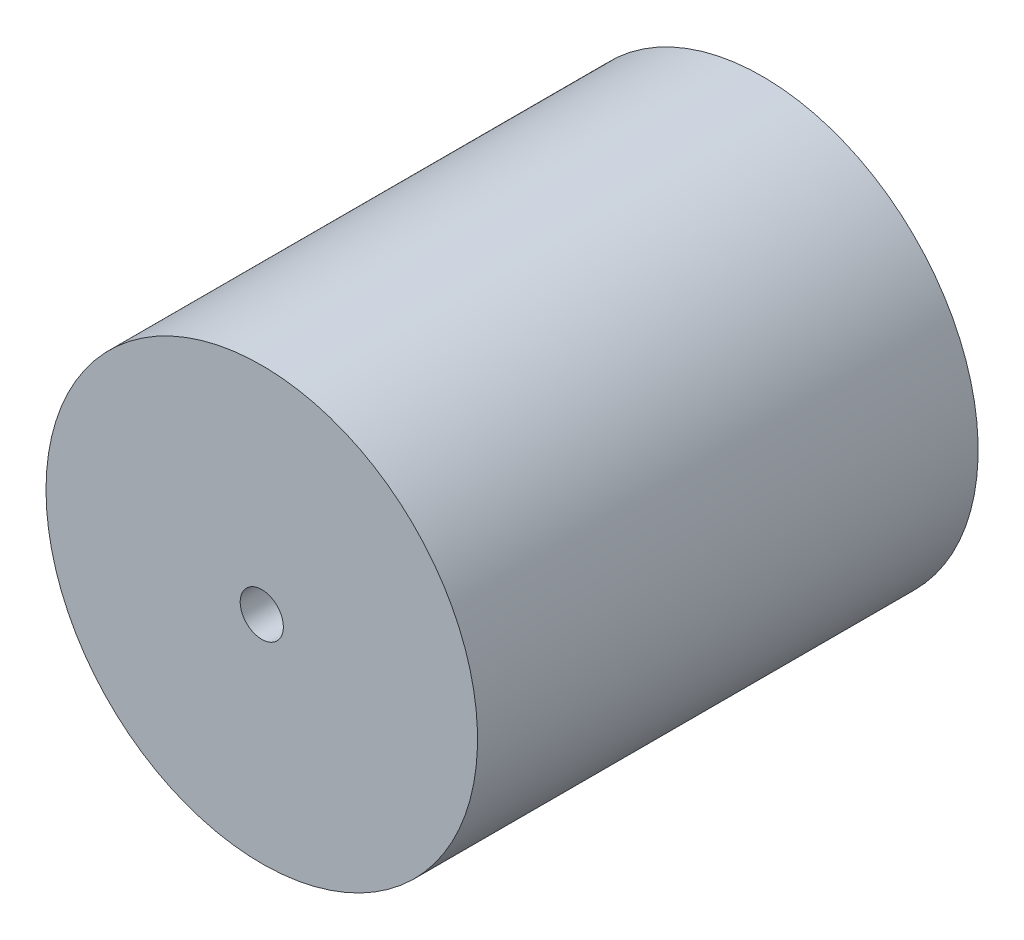
ISO-10303-21;
HEADER;
FILE_DESCRIPTION(('STEP AP214'),'2;1');
FILE_NAME('part.step','',(''),(''),'','','');
FILE_SCHEMA(('AUTOMOTIVE_DESIGN { 1 0 10303 214 1 1 1 1 }'));
ENDSEC;
DATA;
#1=APPLICATION_CONTEXT('core data for automotive mechanical design processes');
#2=APPLICATION_PROTOCOL_DEFINITION('international standard','automotive_design',2000,#1);
#3=PRODUCT_CONTEXT('',#1,'mechanical');
#4=PRODUCT('Part','Part','',(#3));
#5=PRODUCT_RELATED_PRODUCT_CATEGORY('part','',(#4));
#6=PRODUCT_DEFINITION_FORMATION('','',#4);
#7=PRODUCT_DEFINITION_CONTEXT('part definition',#1,'design');
#8=PRODUCT_DEFINITION('design','',#6,#7);
#9=PRODUCT_DEFINITION_SHAPE('','',#8);
#10=(LENGTH_UNIT() NAMED_UNIT(*) SI_UNIT(.MILLI.,.METRE.));
#11=(NAMED_UNIT(*) PLANE_ANGLE_UNIT() SI_UNIT($,.RADIAN.));
#12=(NAMED_UNIT(*) SI_UNIT($,.STERADIAN.) SOLID_ANGLE_UNIT());
#13=UNCERTAINTY_MEASURE_WITH_UNIT(LENGTH_MEASURE(1.E-05),#10,'distance_accuracy_value','');
#14=(GEOMETRIC_REPRESENTATION_CONTEXT(3) GLOBAL_UNCERTAINTY_ASSIGNED_CONTEXT((#13)) GLOBAL_UNIT_ASSIGNED_CONTEXT((#10,
#11,#12)) REPRESENTATION_CONTEXT('',''));
#15=CARTESIAN_POINT('',(0.,0.,0.));
#16=DIRECTION('',(0.,0.,1.));
#17=DIRECTION('',(1.,0.,0.));
#18=AXIS2_PLACEMENT_3D('',#15,#16,#17);
#19=CARTESIAN_POINT('',(0.,0.,29.));
#20=DIRECTION('',(0.,0.,-1.));
#21=DIRECTION('',(-1.,0.,0.));
#22=AXIS2_PLACEMENT_3D('',#19,#20,#21);
#23=CYLINDRICAL_SURFACE('',#22,12.5);
#24=CARTESIAN_POINT('',(0.,0.,29.));
#25=DIRECTION('',(0.,0.,1.));
#26=DIRECTION('',(1.,0.,0.));
#27=AXIS2_PLACEMENT_3D('',#24,#25,#26);
#28=CIRCLE('',#27,12.5);
#29=CARTESIAN_POINT('',(-12.5,0.,29.));
#30=VERTEX_POINT('',#29);
#31=EDGE_CURVE('E11',#30,#30,#28,.T.);
#32=CARTESIAN_POINT('',(0.,0.,0.));
#33=DIRECTION('',(0.,0.,1.));
#34=DIRECTION('',(1.,0.,0.));
#35=AXIS2_PLACEMENT_3D('',#32,#33,#34);
#36=CIRCLE('',#35,12.5);
#37=CARTESIAN_POINT('',(-12.5,0.,0.));
#38=VERTEX_POINT('',#37);
#39=EDGE_CURVE('E48',#38,#38,#36,.T.);
#40=CARTESIAN_POINT('',(-12.5,0.,29.));
#41=CARTESIAN_POINT('',(-12.5,0.,28.6979166666667));
#42=CARTESIAN_POINT('',(-12.5,0.,28.3958333333333));
#43=CARTESIAN_POINT('',(-12.5,0.,27.7916666666667));
#44=CARTESIAN_POINT('',(-12.5,0.,27.4895833333333));
#45=CARTESIAN_POINT('',(-12.5,0.,26.8854166666667));
#46=CARTESIAN_POINT('',(-12.5,0.,26.5833333333333));
#47=CARTESIAN_POINT('',(-12.5,0.,25.9791666666667));
#48=CARTESIAN_POINT('',(-12.5,0.,25.6770833333333));
#49=CARTESIAN_POINT('',(-12.5,0.,25.0729166666667));
#50=CARTESIAN_POINT('',(-12.5,0.,24.7708333333333));
#51=CARTESIAN_POINT('',(-12.5,0.,24.1666666666667));
#52=CARTESIAN_POINT('',(-12.5,0.,23.8645833333333));
#53=CARTESIAN_POINT('',(-12.5,0.,23.2604166666667));
#54=CARTESIAN_POINT('',(-12.5,0.,22.9583333333333));
#55=CARTESIAN_POINT('',(-12.5,0.,22.3541666666667));
#56=CARTESIAN_POINT('',(-12.5,0.,22.0520833333333));
#57=CARTESIAN_POINT('',(-12.5,0.,21.4479166666667));
#58=CARTESIAN_POINT('',(-12.5,0.,21.1458333333333));
#59=CARTESIAN_POINT('',(-12.5,0.,20.5416666666667));
#60=CARTESIAN_POINT('',(-12.5,0.,20.2395833333333));
#61=CARTESIAN_POINT('',(-12.5,0.,19.6354166666667));
#62=CARTESIAN_POINT('',(-12.5,0.,19.3333333333333));
#63=CARTESIAN_POINT('',(-12.5,0.,18.7291666666667));
#64=CARTESIAN_POINT('',(-12.5,0.,18.4270833333333));
#65=CARTESIAN_POINT('',(-12.5,0.,17.8229166666667));
#66=CARTESIAN_POINT('',(-12.5,0.,17.5208333333333));
#67=CARTESIAN_POINT('',(-12.5,0.,16.9166666666667));
#68=CARTESIAN_POINT('',(-12.5,0.,16.6145833333333));
#69=CARTESIAN_POINT('',(-12.5,0.,16.0104166666667));
#70=CARTESIAN_POINT('',(-12.5,0.,15.7083333333333));
#71=CARTESIAN_POINT('',(-12.5,0.,15.1041666666667));
#72=CARTESIAN_POINT('',(-12.5,0.,14.8020833333333));
#73=CARTESIAN_POINT('',(-12.5,0.,14.1979166666667));
#74=CARTESIAN_POINT('',(-12.5,0.,13.8958333333333));
#75=CARTESIAN_POINT('',(-12.5,0.,13.2916666666667));
#76=CARTESIAN_POINT('',(-12.5,0.,12.9895833333333));
#77=CARTESIAN_POINT('',(-12.5,0.,12.3854166666667));
#78=CARTESIAN_POINT('',(-12.5,0.,12.0833333333333));
#79=CARTESIAN_POINT('',(-12.5,0.,11.4791666666667));
#80=CARTESIAN_POINT('',(-12.5,0.,11.1770833333333));
#81=CARTESIAN_POINT('',(-12.5,0.,10.5729166666667));
#82=CARTESIAN_POINT('',(-12.5,0.,10.2708333333333));
#83=CARTESIAN_POINT('',(-12.5,0.,9.66666666666667));
#84=CARTESIAN_POINT('',(-12.5,0.,9.36458333333333));
#85=CARTESIAN_POINT('',(-12.5,0.,8.76041666666667));
#86=CARTESIAN_POINT('',(-12.5,0.,8.45833333333333));
#87=CARTESIAN_POINT('',(-12.5,0.,7.85416666666667));
#88=CARTESIAN_POINT('',(-12.5,0.,7.55208333333333));
#89=CARTESIAN_POINT('',(-12.5,0.,6.94791666666667));
#90=CARTESIAN_POINT('',(-12.5,0.,6.64583333333333));
#91=CARTESIAN_POINT('',(-12.5,0.,6.04166666666667));
#92=CARTESIAN_POINT('',(-12.5,0.,5.73958333333333));
#93=CARTESIAN_POINT('',(-12.5,0.,5.13541666666667));
#94=CARTESIAN_POINT('',(-12.5,0.,4.83333333333333));
#95=CARTESIAN_POINT('',(-12.5,0.,4.22916666666667));
#96=CARTESIAN_POINT('',(-12.5,0.,3.92708333333333));
#97=CARTESIAN_POINT('',(-12.5,0.,3.32291666666667));
#98=CARTESIAN_POINT('',(-12.5,0.,3.02083333333333));
#99=CARTESIAN_POINT('',(-12.5,0.,2.41666666666667));
#100=CARTESIAN_POINT('',(-12.5,0.,2.11458333333333));
#101=CARTESIAN_POINT('',(-12.5,0.,1.51041666666667));
#102=CARTESIAN_POINT('',(-12.5,0.,1.20833333333333));
#103=CARTESIAN_POINT('',(-12.5,0.,0.604166666666667));
#104=CARTESIAN_POINT('',(-12.5,0.,0.302083333333333));
#105=CARTESIAN_POINT('',(-12.5,0.,0.));
#106=B_SPLINE_CURVE_WITH_KNOTS('',3,(#40,#41,#42,#43,#44,#45,#46,#47,#48,#49,#50,#51,#52,#53,
#54,#55,#56,#57,#58,#59,#60,#61,#62,#63,#64,#65,#66,#67,#68,#69,#70,#71,#72,#73,#74,#75,#76,#77,
#78,#79,#80,#81,#82,#83,#84,#85,#86,#87,#88,#89,#90,#91,#92,#93,#94,#95,#96,#97,#98,#99,#100,
#101,#102,#103,#104,#105),.UNSPECIFIED.,.F.,.F.,(4,2,2,2,2,2,2,2,2,2,2,2,2,2,2,2,2,2,2,2,2,2,2,
2,2,2,2,2,2,2,2,2,4),(0.,0.906250000000001,1.8125,2.71875,3.625,4.53125,5.4375,6.34375,7.25,
8.15625,9.0625,9.96875,10.875,11.78125,12.6875,13.59375,14.5,15.40625,16.3125,17.21875,18.125,
19.03125,19.9375,20.84375,21.75,22.65625,23.5625,24.46875,25.375,26.28125,27.1875,28.09375,29.),.UNSPECIFIED.);
#107=EDGE_CURVE('BSEAM45',#30,#38,#106,.T.);
#108=ORIENTED_EDGE('',*,*,#31,.F.);
#109=ORIENTED_EDGE('',*,*,#39,.T.);
#110=ORIENTED_EDGE('',*,*,#107,.T.);
#111=ORIENTED_EDGE('',*,*,#107,.F.);
#112=EDGE_LOOP('',(#108,#110,#109,#111));
#113=FACE_BOUND('',#112,.T.);
#114=ADVANCED_FACE('F45',(#113),#23,.T.);
#115=CARTESIAN_POINT('',(0.,0.,29.));
#116=DIRECTION('',(0.,0.,1.));
#117=DIRECTION('',(1.,0.,0.));
#118=AXIS2_PLACEMENT_3D('',#115,#116,#117);
#119=PLANE('',#118);
#120=CARTESIAN_POINT('',(0.,0.,29.));
#121=DIRECTION('',(0.,0.,1.));
#122=DIRECTION('',(1.,0.,0.));
#123=AXIS2_PLACEMENT_3D('',#120,#121,#122);
#124=CIRCLE('',#123,1.24999999999999);
#125=CARTESIAN_POINT('',(1.24999999999999,0.,29.));
#126=VERTEX_POINT('',#125);
#127=EDGE_CURVE('E66',#126,#126,#124,.T.);
#128=ORIENTED_EDGE('',*,*,#127,.F.);
#129=EDGE_LOOP('',(#128));
#130=FACE_BOUND('',#129,.T.);
#131=ORIENTED_EDGE('',*,*,#31,.T.);
#132=EDGE_LOOP('',(#131));
#133=FACE_BOUND('',#132,.T.);
#134=ADVANCED_FACE('F76',(#130,#133),#119,.T.);
#135=CARTESIAN_POINT('',(0.,0.,0.));
#136=DIRECTION('',(0.,0.,1.));
#137=DIRECTION('',(1.,0.,0.));
#138=AXIS2_PLACEMENT_3D('',#135,#136,#137);
#139=PLANE('',#138);
#140=ORIENTED_EDGE('',*,*,#39,.F.);
#141=EDGE_LOOP('',(#140));
#142=FACE_BOUND('',#141,.T.);
#143=ADVANCED_FACE('F59',(#142),#139,.F.);
#144=CARTESIAN_POINT('',(0.,0.,9.));
#145=DIRECTION('',(0.,0.,1.));
#146=DIRECTION('',(1.,0.,0.));
#147=AXIS2_PLACEMENT_3D('',#144,#145,#146);
#148=CONICAL_SURFACE('',#147,1.25,1.02974425867665);
#149=CARTESIAN_POINT('',(0.,0.,8.24892422621555));
#150=VERTEX_POINT('',#149);
#151=VERTEX_LOOP('',#150);
#152=FACE_BOUND('',#151,.T.);
#153=CARTESIAN_POINT('',(0.,0.,9.));
#154=DIRECTION('',(0.,0.,1.));
#155=DIRECTION('',(1.,0.,0.));
#156=AXIS2_PLACEMENT_3D('',#153,#154,#155);
#157=CIRCLE('',#156,1.25);
#158=CARTESIAN_POINT('',(1.25,0.,9.));
#159=VERTEX_POINT('',#158);
#160=EDGE_CURVE('E63',#159,#159,#157,.T.);
#161=ORIENTED_EDGE('',*,*,#160,.T.);
#162=EDGE_LOOP('',(#161));
#163=FACE_BOUND('',#162,.T.);
#164=ADVANCED_FACE('F55',(#152,#163),#148,.F.);
#165=CARTESIAN_POINT('',(0.,0.,29.));
#166=DIRECTION('',(0.,0.,1.));
#167=DIRECTION('',(1.,0.,0.));
#168=AXIS2_PLACEMENT_3D('',#165,#166,#167);
#169=CYLINDRICAL_SURFACE('',#168,1.24999999999999);
#170=ORIENTED_EDGE('',*,*,#160,.F.);
#171=EDGE_LOOP('',(#170));
#172=FACE_BOUND('',#171,.T.);
#173=ORIENTED_EDGE('',*,*,#127,.T.);
#174=EDGE_LOOP('',(#173));
#175=FACE_BOUND('',#174,.T.);
#176=ADVANCED_FACE('F58',(#172,#175),#169,.F.);
#177=CLOSED_SHELL('',(#114,#134,#143,#164,#176));
#178=MANIFOLD_SOLID_BREP('B2',#177);
#179=ADVANCED_BREP_SHAPE_REPRESENTATION('',(#18,#178),#14);
#180=SHAPE_DEFINITION_REPRESENTATION(#9,#179);
ENDSEC;
END-ISO-10303-21;
